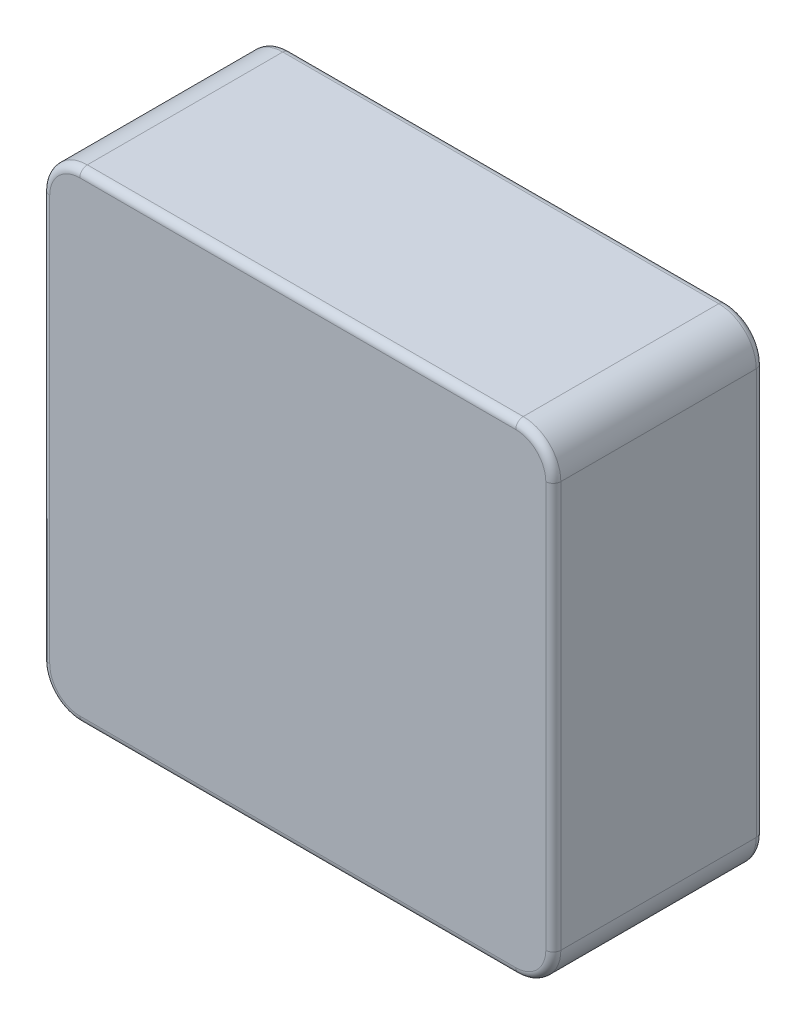
ISO-10303-21;
HEADER;
FILE_DESCRIPTION(('STEP AP214'),'2;1');
FILE_NAME('part.step','',(''),(''),'','','');
FILE_SCHEMA(('AUTOMOTIVE_DESIGN { 1 0 10303 214 1 1 1 1 }'));
ENDSEC;
DATA;
#1=APPLICATION_CONTEXT('core data for automotive mechanical design processes');
#2=APPLICATION_PROTOCOL_DEFINITION('international standard','automotive_design',2000,#1);
#3=PRODUCT_CONTEXT('',#1,'mechanical');
#4=PRODUCT('Part','Part','',(#3));
#5=PRODUCT_RELATED_PRODUCT_CATEGORY('part','',(#4));
#6=PRODUCT_DEFINITION_FORMATION('','',#4);
#7=PRODUCT_DEFINITION_CONTEXT('part definition',#1,'design');
#8=PRODUCT_DEFINITION('design','',#6,#7);
#9=PRODUCT_DEFINITION_SHAPE('','',#8);
#10=(LENGTH_UNIT() NAMED_UNIT(*) SI_UNIT(.MILLI.,.METRE.));
#11=(NAMED_UNIT(*) PLANE_ANGLE_UNIT() SI_UNIT($,.RADIAN.));
#12=(NAMED_UNIT(*) SI_UNIT($,.STERADIAN.) SOLID_ANGLE_UNIT());
#13=UNCERTAINTY_MEASURE_WITH_UNIT(LENGTH_MEASURE(1.E-05),#10,'distance_accuracy_value','');
#14=(GEOMETRIC_REPRESENTATION_CONTEXT(3) GLOBAL_UNCERTAINTY_ASSIGNED_CONTEXT((#13)) GLOBAL_UNIT_ASSIGNED_CONTEXT((#10,
#11,#12)) REPRESENTATION_CONTEXT('',''));
#15=CARTESIAN_POINT('',(0.,0.,0.));
#16=DIRECTION('',(0.,0.,1.));
#17=DIRECTION('',(1.,0.,0.));
#18=AXIS2_PLACEMENT_3D('',#15,#16,#17);
#19=CARTESIAN_POINT('',(2.9,-2.7,0.));
#20=DIRECTION('',(0.,0.,1.));
#21=DIRECTION('',(1.,0.,0.));
#22=AXIS2_PLACEMENT_3D('',#19,#20,#21);
#23=PLANE('',#22);
#24=DIRECTION('',(0.,1.,0.));
#25=VECTOR('',#24,1.);
#26=CARTESIAN_POINT('',(3.3,-2.7,0.));
#27=LINE('',#26,#25);
#28=CARTESIAN_POINT('',(3.3,2.7,0.));
#29=VERTEX_POINT('',#28);
#30=CARTESIAN_POINT('',(3.3,-2.7,0.));
#31=VERTEX_POINT('',#30);
#32=EDGE_CURVE('E287',#29,#31,#27,.F.);
#33=ORIENTED_EDGE('',*,*,#32,.T.);
#34=CARTESIAN_POINT('',(2.9,-2.7,0.));
#35=DIRECTION('',(0.,0.,1.));
#36=DIRECTION('',(1.,0.,0.));
#37=AXIS2_PLACEMENT_3D('',#34,#35,#36);
#38=CIRCLE('',#37,0.4);
#39=CARTESIAN_POINT('',(2.9,-3.1,0.));
#40=VERTEX_POINT('',#39);
#41=EDGE_CURVE('E301',#31,#40,#38,.F.);
#42=ORIENTED_EDGE('',*,*,#41,.T.);
#43=DIRECTION('',(1.,0.,0.));
#44=VECTOR('',#43,1.);
#45=CARTESIAN_POINT('',(2.9,-3.1,0.));
#46=LINE('',#45,#44);
#47=CARTESIAN_POINT('',(-2.9,-3.1,0.));
#48=VERTEX_POINT('',#47);
#49=EDGE_CURVE('E299',#40,#48,#46,.F.);
#50=ORIENTED_EDGE('',*,*,#49,.T.);
#51=CARTESIAN_POINT('',(-2.9,-2.7,0.));
#52=DIRECTION('',(0.,0.,1.));
#53=DIRECTION('',(1.,0.,0.));
#54=AXIS2_PLACEMENT_3D('',#51,#52,#53);
#55=CIRCLE('',#54,0.4);
#56=CARTESIAN_POINT('',(-3.3,-2.7,0.));
#57=VERTEX_POINT('',#56);
#58=EDGE_CURVE('E297',#48,#57,#55,.F.);
#59=ORIENTED_EDGE('',*,*,#58,.T.);
#60=DIRECTION('',(0.,-1.,0.));
#61=VECTOR('',#60,1.);
#62=CARTESIAN_POINT('',(-3.3,-2.7,0.));
#63=LINE('',#62,#61);
#64=CARTESIAN_POINT('',(-3.3,2.7,0.));
#65=VERTEX_POINT('',#64);
#66=EDGE_CURVE('E295',#57,#65,#63,.F.);
#67=ORIENTED_EDGE('',*,*,#66,.T.);
#68=CARTESIAN_POINT('',(-2.9,2.7,0.));
#69=DIRECTION('',(0.,0.,1.));
#70=DIRECTION('',(1.,0.,0.));
#71=AXIS2_PLACEMENT_3D('',#68,#69,#70);
#72=CIRCLE('',#71,0.4);
#73=CARTESIAN_POINT('',(-2.9,3.1,0.));
#74=VERTEX_POINT('',#73);
#75=EDGE_CURVE('E293',#65,#74,#72,.F.);
#76=ORIENTED_EDGE('',*,*,#75,.T.);
#77=DIRECTION('',(-1.,0.,0.));
#78=VECTOR('',#77,1.);
#79=CARTESIAN_POINT('',(2.9,3.1,0.));
#80=LINE('',#79,#78);
#81=CARTESIAN_POINT('',(2.9,3.1,0.));
#82=VERTEX_POINT('',#81);
#83=EDGE_CURVE('E291',#74,#82,#80,.F.);
#84=ORIENTED_EDGE('',*,*,#83,.T.);
#85=CARTESIAN_POINT('',(2.9,2.7,0.));
#86=DIRECTION('',(0.,0.,1.));
#87=DIRECTION('',(1.,0.,0.));
#88=AXIS2_PLACEMENT_3D('',#85,#86,#87);
#89=CIRCLE('',#88,0.4);
#90=EDGE_CURVE('E289',#82,#29,#89,.F.);
#91=ORIENTED_EDGE('',*,*,#90,.T.);
#92=EDGE_LOOP('',(#33,#42,#50,#59,#67,#76,#84,#91));
#93=FACE_BOUND('',#92,.T.);
#94=DIRECTION('',(0.,-1.,0.));
#95=VECTOR('',#94,1.);
#96=CARTESIAN_POINT('',(2.525,2.7,0.));
#97=LINE('',#96,#95);
#98=CARTESIAN_POINT('',(2.525,2.7,0.));
#99=VERTEX_POINT('',#98);
#100=CARTESIAN_POINT('',(2.525,1.3,0.));
#101=VERTEX_POINT('',#100);
#102=EDGE_CURVE('E220',#99,#101,#97,.T.);
#103=ORIENTED_EDGE('',*,*,#102,.F.);
#104=DIRECTION('',(1.,0.,0.));
#105=VECTOR('',#104,1.);
#106=CARTESIAN_POINT('',(2.525,2.7,0.));
#107=LINE('',#106,#105);
#108=CARTESIAN_POINT('',(-2.525,2.7,0.));
#109=VERTEX_POINT('',#108);
#110=EDGE_CURVE('E233',#109,#99,#107,.T.);
#111=ORIENTED_EDGE('',*,*,#110,.F.);
#112=DIRECTION('',(0.,1.,0.));
#113=VECTOR('',#112,1.);
#114=CARTESIAN_POINT('',(-2.525,2.7,0.));
#115=LINE('',#114,#113);
#116=CARTESIAN_POINT('',(-2.525,1.3,0.));
#117=VERTEX_POINT('',#116);
#118=EDGE_CURVE('E242',#117,#109,#115,.T.);
#119=ORIENTED_EDGE('',*,*,#118,.F.);
#120=DIRECTION('',(-1.,0.,0.));
#121=VECTOR('',#120,1.);
#122=CARTESIAN_POINT('',(2.525,1.3,0.));
#123=LINE('',#122,#121);
#124=EDGE_CURVE('E223',#101,#117,#123,.T.);
#125=ORIENTED_EDGE('',*,*,#124,.F.);
#126=EDGE_LOOP('',(#103,#111,#119,#125));
#127=FACE_BOUND('',#126,.T.);
#128=DIRECTION('',(0.,-1.,0.));
#129=VECTOR('',#128,1.);
#130=CARTESIAN_POINT('',(2.525,-1.3,0.));
#131=LINE('',#130,#129);
#132=CARTESIAN_POINT('',(2.525,-1.3,0.));
#133=VERTEX_POINT('',#132);
#134=CARTESIAN_POINT('',(2.525,-2.7,0.));
#135=VERTEX_POINT('',#134);
#136=EDGE_CURVE('E219',#133,#135,#131,.T.);
#137=ORIENTED_EDGE('',*,*,#136,.F.);
#138=DIRECTION('',(1.,0.,0.));
#139=VECTOR('',#138,1.);
#140=CARTESIAN_POINT('',(2.525,-1.3,0.));
#141=LINE('',#140,#139);
#142=CARTESIAN_POINT('',(-2.525,-1.3,0.));
#143=VERTEX_POINT('',#142);
#144=EDGE_CURVE('E216',#143,#133,#141,.T.);
#145=ORIENTED_EDGE('',*,*,#144,.F.);
#146=DIRECTION('',(0.,1.,0.));
#147=VECTOR('',#146,1.);
#148=CARTESIAN_POINT('',(-2.525,-1.3,0.));
#149=LINE('',#148,#147);
#150=CARTESIAN_POINT('',(-2.525,-2.7,0.));
#151=VERTEX_POINT('',#150);
#152=EDGE_CURVE('E792',#151,#143,#149,.T.);
#153=ORIENTED_EDGE('',*,*,#152,.F.);
#154=DIRECTION('',(-1.,0.,0.));
#155=VECTOR('',#154,1.);
#156=CARTESIAN_POINT('',(2.525,-2.7,0.));
#157=LINE('',#156,#155);
#158=EDGE_CURVE('E798',#135,#151,#157,.T.);
#159=ORIENTED_EDGE('',*,*,#158,.F.);
#160=EDGE_LOOP('',(#137,#145,#153,#159));
#161=FACE_BOUND('',#160,.T.);
#162=ADVANCED_FACE('F33',(#93,#127,#161),#23,.F.);
#163=CARTESIAN_POINT('',(2.9,-2.7,2.8));
#164=DIRECTION('',(0.,0.,-1.));
#165=DIRECTION('',(-1.,0.,0.));
#166=AXIS2_PLACEMENT_3D('',#163,#164,#165);
#167=CYLINDRICAL_SURFACE('',#166,0.5);
#168=DIRECTION('',(0.,0.,-1.));
#169=VECTOR('',#168,1.);
#170=CARTESIAN_POINT('',(2.9,-3.2,2.8));
#171=LINE('',#170,#169);
#172=CARTESIAN_POINT('',(2.9,-3.2,2.7));
#173=VERTEX_POINT('',#172);
#174=CARTESIAN_POINT('',(2.9,-3.2,0.0999999999999998));
#175=VERTEX_POINT('',#174);
#176=EDGE_CURVE('E258',#173,#175,#171,.T.);
#177=ORIENTED_EDGE('',*,*,#176,.T.);
#178=CARTESIAN_POINT('',(2.9,-2.7,0.0999999999999998));
#179=DIRECTION('',(0.,0.,1.));
#180=DIRECTION('',(1.,0.,0.));
#181=AXIS2_PLACEMENT_3D('',#178,#179,#180);
#182=CIRCLE('',#181,0.5);
#183=CARTESIAN_POINT('',(3.4,-2.7,0.0999999999999998));
#184=VERTEX_POINT('',#183);
#185=EDGE_CURVE('E284',#175,#184,#182,.T.);
#186=ORIENTED_EDGE('',*,*,#185,.T.);
#187=DIRECTION('',(0.,0.,-1.));
#188=VECTOR('',#187,1.);
#189=CARTESIAN_POINT('',(3.4,-2.7,2.8));
#190=LINE('',#189,#188);
#191=CARTESIAN_POINT('',(3.4,-2.7,2.7));
#192=VERTEX_POINT('',#191);
#193=EDGE_CURVE('E279',#192,#184,#190,.T.);
#194=ORIENTED_EDGE('',*,*,#193,.F.);
#195=CARTESIAN_POINT('',(2.9,-2.7,2.7));
#196=DIRECTION('',(0.,0.,1.));
#197=DIRECTION('',(1.,0.,0.));
#198=AXIS2_PLACEMENT_3D('',#195,#196,#197);
#199=CIRCLE('',#198,0.5);
#200=EDGE_CURVE('E282',#192,#173,#199,.F.);
#201=ORIENTED_EDGE('',*,*,#200,.T.);
#202=EDGE_LOOP('',(#177,#186,#194,#201));
#203=FACE_BOUND('',#202,.T.);
#204=ADVANCED_FACE('F477',(#203),#167,.T.);
#205=CARTESIAN_POINT('',(3.4,-2.7,2.8));
#206=DIRECTION('',(-1.,0.,0.));
#207=DIRECTION('',(0.,0.,1.));
#208=AXIS2_PLACEMENT_3D('',#205,#206,#207);
#209=PLANE('',#208);
#210=DIRECTION('',(0.,0.,-1.));
#211=VECTOR('',#210,1.);
#212=CARTESIAN_POINT('',(3.4,2.7,2.8));
#213=LINE('',#212,#211);
#214=CARTESIAN_POINT('',(3.4,2.7,2.7));
#215=VERTEX_POINT('',#214);
#216=CARTESIAN_POINT('',(3.4,2.7,0.0999999999999998));
#217=VERTEX_POINT('',#216);
#218=EDGE_CURVE('E276',#215,#217,#213,.T.);
#219=ORIENTED_EDGE('',*,*,#218,.F.);
#220=DIRECTION('',(0.,1.,0.));
#221=VECTOR('',#220,1.);
#222=CARTESIAN_POINT('',(3.4,-2.7,2.7));
#223=LINE('',#222,#221);
#224=EDGE_CURVE('E11',#215,#192,#223,.F.);
#225=ORIENTED_EDGE('',*,*,#224,.T.);
#226=ORIENTED_EDGE('',*,*,#193,.T.);
#227=DIRECTION('',(0.,1.,0.));
#228=VECTOR('',#227,1.);
#229=CARTESIAN_POINT('',(3.4,-2.7,0.0999999999999998));
#230=LINE('',#229,#228);
#231=EDGE_CURVE('E42',#184,#217,#230,.T.);
#232=ORIENTED_EDGE('',*,*,#231,.T.);
#233=EDGE_LOOP('',(#219,#225,#226,#232));
#234=FACE_BOUND('',#233,.T.);
#235=ADVANCED_FACE('F496',(#234),#209,.F.);
#236=CARTESIAN_POINT('',(2.9,2.7,2.8));
#237=DIRECTION('',(0.,0.,-1.));
#238=DIRECTION('',(-1.,0.,0.));
#239=AXIS2_PLACEMENT_3D('',#236,#237,#238);
#240=CYLINDRICAL_SURFACE('',#239,0.5);
#241=ORIENTED_EDGE('',*,*,#218,.T.);
#242=CARTESIAN_POINT('',(2.9,2.7,0.0999999999999998));
#243=DIRECTION('',(0.,0.,1.));
#244=DIRECTION('',(1.,0.,0.));
#245=AXIS2_PLACEMENT_3D('',#242,#243,#244);
#246=CIRCLE('',#245,0.5);
#247=CARTESIAN_POINT('',(2.9,3.2,0.0999999999999998));
#248=VERTEX_POINT('',#247);
#249=EDGE_CURVE('E327',#217,#248,#246,.T.);
#250=ORIENTED_EDGE('',*,*,#249,.T.);
#251=DIRECTION('',(0.,0.,-1.));
#252=VECTOR('',#251,1.);
#253=CARTESIAN_POINT('',(2.9,3.2,2.8));
#254=LINE('',#253,#252);
#255=CARTESIAN_POINT('',(2.9,3.2,2.7));
#256=VERTEX_POINT('',#255);
#257=EDGE_CURVE('E273',#256,#248,#254,.T.);
#258=ORIENTED_EDGE('',*,*,#257,.F.);
#259=CARTESIAN_POINT('',(2.9,2.7,2.7));
#260=DIRECTION('',(0.,0.,1.));
#261=DIRECTION('',(1.,0.,0.));
#262=AXIS2_PLACEMENT_3D('',#259,#260,#261);
#263=CIRCLE('',#262,0.5);
#264=EDGE_CURVE('E325',#256,#215,#263,.F.);
#265=ORIENTED_EDGE('',*,*,#264,.T.);
#266=EDGE_LOOP('',(#241,#250,#258,#265));
#267=FACE_BOUND('',#266,.T.);
#268=ADVANCED_FACE('F403',(#267),#240,.T.);
#269=CARTESIAN_POINT('',(-2.9,3.2,2.8));
#270=DIRECTION('',(0.,-1.,0.));
#271=DIRECTION('',(0.,0.,-1.));
#272=AXIS2_PLACEMENT_3D('',#269,#270,#271);
#273=PLANE('',#272);
#274=ORIENTED_EDGE('',*,*,#257,.T.);
#275=DIRECTION('',(-1.,0.,0.));
#276=VECTOR('',#275,1.);
#277=CARTESIAN_POINT('',(-2.9,3.2,0.0999999999999998));
#278=LINE('',#277,#276);
#279=CARTESIAN_POINT('',(-2.9,3.2,0.0999999999999998));
#280=VERTEX_POINT('',#279);
#281=EDGE_CURVE('E323',#248,#280,#278,.T.);
#282=ORIENTED_EDGE('',*,*,#281,.T.);
#283=DIRECTION('',(0.,0.,-1.));
#284=VECTOR('',#283,1.);
#285=CARTESIAN_POINT('',(-2.9,3.2,2.8));
#286=LINE('',#285,#284);
#287=CARTESIAN_POINT('',(-2.9,3.2,2.7));
#288=VERTEX_POINT('',#287);
#289=EDGE_CURVE('E270',#288,#280,#286,.T.);
#290=ORIENTED_EDGE('',*,*,#289,.F.);
#291=DIRECTION('',(-1.,0.,0.));
#292=VECTOR('',#291,1.);
#293=CARTESIAN_POINT('',(2.9,3.2,2.7));
#294=LINE('',#293,#292);
#295=EDGE_CURVE('E321',#288,#256,#294,.F.);
#296=ORIENTED_EDGE('',*,*,#295,.T.);
#297=EDGE_LOOP('',(#274,#282,#290,#296));
#298=FACE_BOUND('',#297,.T.);
#299=ADVANCED_FACE('F400',(#298),#273,.F.);
#300=CARTESIAN_POINT('',(-2.9,2.7,2.8));
#301=DIRECTION('',(0.,0.,-1.));
#302=DIRECTION('',(-1.,0.,0.));
#303=AXIS2_PLACEMENT_3D('',#300,#301,#302);
#304=CYLINDRICAL_SURFACE('',#303,0.5);
#305=ORIENTED_EDGE('',*,*,#289,.T.);
#306=CARTESIAN_POINT('',(-2.9,2.7,0.0999999999999998));
#307=DIRECTION('',(0.,0.,1.));
#308=DIRECTION('',(1.,0.,0.));
#309=AXIS2_PLACEMENT_3D('',#306,#307,#308);
#310=CIRCLE('',#309,0.5);
#311=CARTESIAN_POINT('',(-3.4,2.7,0.0999999999999998));
#312=VERTEX_POINT('',#311);
#313=EDGE_CURVE('E319',#280,#312,#310,.T.);
#314=ORIENTED_EDGE('',*,*,#313,.T.);
#315=DIRECTION('',(0.,0.,-1.));
#316=VECTOR('',#315,1.);
#317=CARTESIAN_POINT('',(-3.4,2.7,2.8));
#318=LINE('',#317,#316);
#319=CARTESIAN_POINT('',(-3.4,2.7,2.7));
#320=VERTEX_POINT('',#319);
#321=EDGE_CURVE('E267',#320,#312,#318,.T.);
#322=ORIENTED_EDGE('',*,*,#321,.F.);
#323=CARTESIAN_POINT('',(-2.9,2.7,2.7));
#324=DIRECTION('',(0.,0.,1.));
#325=DIRECTION('',(1.,0.,0.));
#326=AXIS2_PLACEMENT_3D('',#323,#324,#325);
#327=CIRCLE('',#326,0.5);
#328=EDGE_CURVE('E317',#320,#288,#327,.F.);
#329=ORIENTED_EDGE('',*,*,#328,.T.);
#330=EDGE_LOOP('',(#305,#314,#322,#329));
#331=FACE_BOUND('',#330,.T.);
#332=ADVANCED_FACE('F447',(#331),#304,.T.);
#333=CARTESIAN_POINT('',(-3.4,-2.7,2.8));
#334=DIRECTION('',(1.,0.,0.));
#335=DIRECTION('',(0.,0.,-1.));
#336=AXIS2_PLACEMENT_3D('',#333,#334,#335);
#337=PLANE('',#336);
#338=ORIENTED_EDGE('',*,*,#321,.T.);
#339=DIRECTION('',(0.,-1.,0.));
#340=VECTOR('',#339,1.);
#341=CARTESIAN_POINT('',(-3.4,-2.7,0.0999999999999998));
#342=LINE('',#341,#340);
#343=CARTESIAN_POINT('',(-3.4,-2.7,0.0999999999999998));
#344=VERTEX_POINT('',#343);
#345=EDGE_CURVE('E315',#312,#344,#342,.T.);
#346=ORIENTED_EDGE('',*,*,#345,.T.);
#347=DIRECTION('',(0.,0.,-1.));
#348=VECTOR('',#347,1.);
#349=CARTESIAN_POINT('',(-3.4,-2.7,2.8));
#350=LINE('',#349,#348);
#351=CARTESIAN_POINT('',(-3.4,-2.7,2.7));
#352=VERTEX_POINT('',#351);
#353=EDGE_CURVE('E264',#352,#344,#350,.T.);
#354=ORIENTED_EDGE('',*,*,#353,.F.);
#355=DIRECTION('',(0.,-1.,0.));
#356=VECTOR('',#355,1.);
#357=CARTESIAN_POINT('',(-3.4,2.7,2.7));
#358=LINE('',#357,#356);
#359=EDGE_CURVE('E313',#352,#320,#358,.F.);
#360=ORIENTED_EDGE('',*,*,#359,.T.);
#361=EDGE_LOOP('',(#338,#346,#354,#360));
#362=FACE_BOUND('',#361,.T.);
#363=ADVANCED_FACE('F450',(#362),#337,.F.);
#364=CARTESIAN_POINT('',(-2.9,-2.7,2.8));
#365=DIRECTION('',(0.,0.,-1.));
#366=DIRECTION('',(-1.,0.,0.));
#367=AXIS2_PLACEMENT_3D('',#364,#365,#366);
#368=CYLINDRICAL_SURFACE('',#367,0.5);
#369=ORIENTED_EDGE('',*,*,#353,.T.);
#370=CARTESIAN_POINT('',(-2.9,-2.7,0.0999999999999998));
#371=DIRECTION('',(0.,0.,1.));
#372=DIRECTION('',(1.,0.,0.));
#373=AXIS2_PLACEMENT_3D('',#370,#371,#372);
#374=CIRCLE('',#373,0.5);
#375=CARTESIAN_POINT('',(-2.9,-3.2,0.0999999999999998));
#376=VERTEX_POINT('',#375);
#377=EDGE_CURVE('E311',#344,#376,#374,.T.);
#378=ORIENTED_EDGE('',*,*,#377,.T.);
#379=DIRECTION('',(0.,0.,-1.));
#380=VECTOR('',#379,1.);
#381=CARTESIAN_POINT('',(-2.9,-3.2,2.8));
#382=LINE('',#381,#380);
#383=CARTESIAN_POINT('',(-2.9,-3.2,2.7));
#384=VERTEX_POINT('',#383);
#385=EDGE_CURVE('E261',#384,#376,#382,.T.);
#386=ORIENTED_EDGE('',*,*,#385,.F.);
#387=CARTESIAN_POINT('',(-2.9,-2.7,2.7));
#388=DIRECTION('',(0.,0.,1.));
#389=DIRECTION('',(1.,0.,0.));
#390=AXIS2_PLACEMENT_3D('',#387,#388,#389);
#391=CIRCLE('',#390,0.5);
#392=EDGE_CURVE('E309',#384,#352,#391,.F.);
#393=ORIENTED_EDGE('',*,*,#392,.T.);
#394=EDGE_LOOP('',(#369,#378,#386,#393));
#395=FACE_BOUND('',#394,.T.);
#396=ADVANCED_FACE('F482',(#395),#368,.T.);
#397=CARTESIAN_POINT('',(-2.9,-3.2,2.8));
#398=DIRECTION('',(0.,1.,0.));
#399=DIRECTION('',(0.,0.,1.));
#400=AXIS2_PLACEMENT_3D('',#397,#398,#399);
#401=PLANE('',#400);
#402=ORIENTED_EDGE('',*,*,#385,.T.);
#403=DIRECTION('',(1.,0.,0.));
#404=VECTOR('',#403,1.);
#405=CARTESIAN_POINT('',(-2.9,-3.2,0.0999999999999998));
#406=LINE('',#405,#404);
#407=EDGE_CURVE('E307',#376,#175,#406,.T.);
#408=ORIENTED_EDGE('',*,*,#407,.T.);
#409=ORIENTED_EDGE('',*,*,#176,.F.);
#410=DIRECTION('',(1.,0.,0.));
#411=VECTOR('',#410,1.);
#412=CARTESIAN_POINT('',(-2.9,-3.2,2.7));
#413=LINE('',#412,#411);
#414=EDGE_CURVE('E304',#173,#384,#413,.F.);
#415=ORIENTED_EDGE('',*,*,#414,.T.);
#416=EDGE_LOOP('',(#402,#408,#409,#415));
#417=FACE_BOUND('',#416,.T.);
#418=ADVANCED_FACE('F479',(#417),#401,.F.);
#419=CARTESIAN_POINT('',(2.9,-2.7,2.8));
#420=DIRECTION('',(0.,0.,1.));
#421=DIRECTION('',(1.,0.,0.));
#422=AXIS2_PLACEMENT_3D('',#419,#420,#421);
#423=PLANE('',#422);
#424=CARTESIAN_POINT('',(-2.9,-2.7,2.8));
#425=DIRECTION('',(0.,0.,1.));
#426=DIRECTION('',(1.,0.,0.));
#427=AXIS2_PLACEMENT_3D('',#424,#425,#426);
#428=CIRCLE('',#427,0.4);
#429=CARTESIAN_POINT('',(-3.3,-2.7,2.8));
#430=VERTEX_POINT('',#429);
#431=CARTESIAN_POINT('',(-2.9,-3.1,2.8));
#432=VERTEX_POINT('',#431);
#433=EDGE_CURVE('E50',#430,#432,#428,.T.);
#434=ORIENTED_EDGE('',*,*,#433,.T.);
#435=DIRECTION('',(1.,0.,0.));
#436=VECTOR('',#435,1.);
#437=CARTESIAN_POINT('',(2.9,-3.1,2.8));
#438=LINE('',#437,#436);
#439=CARTESIAN_POINT('',(2.9,-3.1,2.8));
#440=VERTEX_POINT('',#439);
#441=EDGE_CURVE('E341',#432,#440,#438,.T.);
#442=ORIENTED_EDGE('',*,*,#441,.T.);
#443=CARTESIAN_POINT('',(2.9,-2.7,2.8));
#444=DIRECTION('',(0.,0.,1.));
#445=DIRECTION('',(1.,0.,0.));
#446=AXIS2_PLACEMENT_3D('',#443,#444,#445);
#447=CIRCLE('',#446,0.4);
#448=CARTESIAN_POINT('',(3.3,-2.7,2.8));
#449=VERTEX_POINT('',#448);
#450=EDGE_CURVE('E329',#440,#449,#447,.T.);
#451=ORIENTED_EDGE('',*,*,#450,.T.);
#452=DIRECTION('',(0.,1.,0.));
#453=VECTOR('',#452,1.);
#454=CARTESIAN_POINT('',(3.3,2.7,2.8));
#455=LINE('',#454,#453);
#456=CARTESIAN_POINT('',(3.3,2.7,2.8));
#457=VERTEX_POINT('',#456);
#458=EDGE_CURVE('E331',#449,#457,#455,.T.);
#459=ORIENTED_EDGE('',*,*,#458,.T.);
#460=CARTESIAN_POINT('',(2.9,2.7,2.8));
#461=DIRECTION('',(0.,0.,1.));
#462=DIRECTION('',(1.,0.,0.));
#463=AXIS2_PLACEMENT_3D('',#460,#461,#462);
#464=CIRCLE('',#463,0.4);
#465=CARTESIAN_POINT('',(2.9,3.1,2.8));
#466=VERTEX_POINT('',#465);
#467=EDGE_CURVE('E333',#457,#466,#464,.T.);
#468=ORIENTED_EDGE('',*,*,#467,.T.);
#469=DIRECTION('',(-1.,0.,0.));
#470=VECTOR('',#469,1.);
#471=CARTESIAN_POINT('',(-2.9,3.1,2.8));
#472=LINE('',#471,#470);
#473=CARTESIAN_POINT('',(-2.9,3.1,2.8));
#474=VERTEX_POINT('',#473);
#475=EDGE_CURVE('E335',#466,#474,#472,.T.);
#476=ORIENTED_EDGE('',*,*,#475,.T.);
#477=CARTESIAN_POINT('',(-2.9,2.7,2.8));
#478=DIRECTION('',(0.,0.,1.));
#479=DIRECTION('',(1.,0.,0.));
#480=AXIS2_PLACEMENT_3D('',#477,#478,#479);
#481=CIRCLE('',#480,0.4);
#482=CARTESIAN_POINT('',(-3.3,2.7,2.8));
#483=VERTEX_POINT('',#482);
#484=EDGE_CURVE('E337',#474,#483,#481,.T.);
#485=ORIENTED_EDGE('',*,*,#484,.T.);
#486=DIRECTION('',(0.,-1.,0.));
#487=VECTOR('',#486,1.);
#488=CARTESIAN_POINT('',(-3.3,-2.7,2.8));
#489=LINE('',#488,#487);
#490=EDGE_CURVE('E55',#483,#430,#489,.T.);
#491=ORIENTED_EDGE('',*,*,#490,.T.);
#492=EDGE_LOOP('',(#434,#442,#451,#459,#468,#476,#485,#491));
#493=FACE_BOUND('',#492,.T.);
#494=ADVANCED_FACE('F464',(#493),#423,.T.);
#495=CARTESIAN_POINT('',(2.525,2.7,-0.1));
#496=DIRECTION('',(-1.,0.,0.));
#497=DIRECTION('',(0.,0.,1.));
#498=AXIS2_PLACEMENT_3D('',#495,#496,#497);
#499=PLANE('',#498);
#500=ORIENTED_EDGE('',*,*,#102,.T.);
#501=DIRECTION('',(0.,0.,1.));
#502=VECTOR('',#501,1.);
#503=CARTESIAN_POINT('',(2.525,1.3,-0.1));
#504=LINE('',#503,#502);
#505=CARTESIAN_POINT('',(2.525,1.3,-0.1));
#506=VERTEX_POINT('',#505);
#507=EDGE_CURVE('E255',#506,#101,#504,.T.);
#508=ORIENTED_EDGE('',*,*,#507,.F.);
#509=DIRECTION('',(0.,-1.,0.));
#510=VECTOR('',#509,1.);
#511=CARTESIAN_POINT('',(2.525,2.7,-0.1));
#512=LINE('',#511,#510);
#513=CARTESIAN_POINT('',(2.525,2.7,-0.1));
#514=VERTEX_POINT('',#513);
#515=EDGE_CURVE('E229',#514,#506,#512,.T.);
#516=ORIENTED_EDGE('',*,*,#515,.F.);
#517=DIRECTION('',(0.,0.,1.));
#518=VECTOR('',#517,1.);
#519=CARTESIAN_POINT('',(2.525,2.7,-0.1));
#520=LINE('',#519,#518);
#521=EDGE_CURVE('E238',#514,#99,#520,.T.);
#522=ORIENTED_EDGE('',*,*,#521,.T.);
#523=EDGE_LOOP('',(#500,#508,#516,#522));
#524=FACE_BOUND('',#523,.T.);
#525=ADVANCED_FACE('F501',(#524),#499,.F.);
#526=CARTESIAN_POINT('',(2.525,1.3,-0.1));
#527=DIRECTION('',(0.,1.,0.));
#528=DIRECTION('',(-1.,0.,0.));
#529=AXIS2_PLACEMENT_3D('',#526,#527,#528);
#530=PLANE('',#529);
#531=ORIENTED_EDGE('',*,*,#124,.T.);
#532=DIRECTION('',(0.,0.,1.));
#533=VECTOR('',#532,1.);
#534=CARTESIAN_POINT('',(-2.525,1.3,-0.1));
#535=LINE('',#534,#533);
#536=CARTESIAN_POINT('',(-2.525,1.3,-0.1));
#537=VERTEX_POINT('',#536);
#538=EDGE_CURVE('E252',#537,#117,#535,.T.);
#539=ORIENTED_EDGE('',*,*,#538,.F.);
#540=DIRECTION('',(-1.,0.,0.));
#541=VECTOR('',#540,1.);
#542=CARTESIAN_POINT('',(2.525,1.3,-0.1));
#543=LINE('',#542,#541);
#544=EDGE_CURVE('E232',#506,#537,#543,.T.);
#545=ORIENTED_EDGE('',*,*,#544,.F.);
#546=ORIENTED_EDGE('',*,*,#507,.T.);
#547=EDGE_LOOP('',(#531,#539,#545,#546));
#548=FACE_BOUND('',#547,.T.);
#549=ADVANCED_FACE('F504',(#548),#530,.F.);
#550=CARTESIAN_POINT('',(-2.525,2.7,-0.1));
#551=DIRECTION('',(1.,0.,0.));
#552=DIRECTION('',(0.,1.,0.));
#553=AXIS2_PLACEMENT_3D('',#550,#551,#552);
#554=PLANE('',#553);
#555=ORIENTED_EDGE('',*,*,#118,.T.);
#556=DIRECTION('',(0.,0.,1.));
#557=VECTOR('',#556,1.);
#558=CARTESIAN_POINT('',(-2.525,2.7,-0.1));
#559=LINE('',#558,#557);
#560=CARTESIAN_POINT('',(-2.525,2.7,-0.1));
#561=VERTEX_POINT('',#560);
#562=EDGE_CURVE('E249',#561,#109,#559,.T.);
#563=ORIENTED_EDGE('',*,*,#562,.F.);
#564=DIRECTION('',(0.,1.,0.));
#565=VECTOR('',#564,1.);
#566=CARTESIAN_POINT('',(-2.525,2.7,-0.1));
#567=LINE('',#566,#565);
#568=EDGE_CURVE('E235',#537,#561,#567,.T.);
#569=ORIENTED_EDGE('',*,*,#568,.F.);
#570=ORIENTED_EDGE('',*,*,#538,.T.);
#571=EDGE_LOOP('',(#555,#563,#569,#570));
#572=FACE_BOUND('',#571,.T.);
#573=ADVANCED_FACE('F508',(#572),#554,.F.);
#574=CARTESIAN_POINT('',(2.525,2.7,-0.1));
#575=DIRECTION('',(0.,-1.,0.));
#576=DIRECTION('',(1.,0.,0.));
#577=AXIS2_PLACEMENT_3D('',#574,#575,#576);
#578=PLANE('',#577);
#579=ORIENTED_EDGE('',*,*,#110,.T.);
#580=ORIENTED_EDGE('',*,*,#521,.F.);
#581=DIRECTION('',(1.,0.,0.));
#582=VECTOR('',#581,1.);
#583=CARTESIAN_POINT('',(2.525,2.7,-0.1));
#584=LINE('',#583,#582);
#585=EDGE_CURVE('E237',#561,#514,#584,.T.);
#586=ORIENTED_EDGE('',*,*,#585,.F.);
#587=ORIENTED_EDGE('',*,*,#562,.T.);
#588=EDGE_LOOP('',(#579,#580,#586,#587));
#589=FACE_BOUND('',#588,.T.);
#590=ADVANCED_FACE('F512',(#589),#578,.F.);
#591=CARTESIAN_POINT('',(0.,0.,-0.1));
#592=DIRECTION('',(0.,0.,-1.));
#593=DIRECTION('',(-1.,0.,0.));
#594=AXIS2_PLACEMENT_3D('',#591,#592,#593);
#595=PLANE('',#594);
#596=ORIENTED_EDGE('',*,*,#515,.T.);
#597=ORIENTED_EDGE('',*,*,#544,.T.);
#598=ORIENTED_EDGE('',*,*,#568,.T.);
#599=ORIENTED_EDGE('',*,*,#585,.T.);
#600=EDGE_LOOP('',(#596,#597,#598,#599));
#601=FACE_BOUND('',#600,.T.);
#602=ADVANCED_FACE('F516',(#601),#595,.T.);
#603=CARTESIAN_POINT('',(2.525,-1.3,-0.1));
#604=DIRECTION('',(-1.,0.,0.));
#605=DIRECTION('',(0.,-1.,0.));
#606=AXIS2_PLACEMENT_3D('',#603,#604,#605);
#607=PLANE('',#606);
#608=ORIENTED_EDGE('',*,*,#136,.T.);
#609=DIRECTION('',(0.,0.,1.));
#610=VECTOR('',#609,1.);
#611=CARTESIAN_POINT('',(2.525,-2.7,-0.1));
#612=LINE('',#611,#610);
#613=CARTESIAN_POINT('',(2.525,-2.7,-0.1));
#614=VERTEX_POINT('',#613);
#615=EDGE_CURVE('E200',#614,#135,#612,.T.);
#616=ORIENTED_EDGE('',*,*,#615,.F.);
#617=DIRECTION('',(0.,-1.,0.));
#618=VECTOR('',#617,1.);
#619=CARTESIAN_POINT('',(2.525,-1.3,-0.1));
#620=LINE('',#619,#618);
#621=CARTESIAN_POINT('',(2.525,-1.3,-0.1));
#622=VERTEX_POINT('',#621);
#623=EDGE_CURVE('E207',#622,#614,#620,.T.);
#624=ORIENTED_EDGE('',*,*,#623,.F.);
#625=DIRECTION('',(0.,0.,1.));
#626=VECTOR('',#625,1.);
#627=CARTESIAN_POINT('',(2.525,-1.3,-0.1));
#628=LINE('',#627,#626);
#629=EDGE_CURVE('E788',#622,#133,#628,.T.);
#630=ORIENTED_EDGE('',*,*,#629,.T.);
#631=EDGE_LOOP('',(#608,#616,#624,#630));
#632=FACE_BOUND('',#631,.T.);
#633=ADVANCED_FACE('F218',(#632),#607,.F.);
#634=CARTESIAN_POINT('',(2.525,-2.7,-0.1));
#635=DIRECTION('',(0.,1.,0.));
#636=DIRECTION('',(0.,0.,1.));
#637=AXIS2_PLACEMENT_3D('',#634,#635,#636);
#638=PLANE('',#637);
#639=ORIENTED_EDGE('',*,*,#158,.T.);
#640=DIRECTION('',(0.,0.,1.));
#641=VECTOR('',#640,1.);
#642=CARTESIAN_POINT('',(-2.525,-2.7,-0.1));
#643=LINE('',#642,#641);
#644=CARTESIAN_POINT('',(-2.525,-2.7,-0.1));
#645=VERTEX_POINT('',#644);
#646=EDGE_CURVE('E203',#645,#151,#643,.T.);
#647=ORIENTED_EDGE('',*,*,#646,.F.);
#648=DIRECTION('',(-1.,0.,0.));
#649=VECTOR('',#648,1.);
#650=CARTESIAN_POINT('',(2.525,-2.7,-0.1));
#651=LINE('',#650,#649);
#652=EDGE_CURVE('E195',#614,#645,#651,.T.);
#653=ORIENTED_EDGE('',*,*,#652,.F.);
#654=ORIENTED_EDGE('',*,*,#615,.T.);
#655=EDGE_LOOP('',(#639,#647,#653,#654));
#656=FACE_BOUND('',#655,.T.);
#657=ADVANCED_FACE('F198',(#656),#638,.F.);
#658=CARTESIAN_POINT('',(-2.525,-1.3,-0.1));
#659=DIRECTION('',(1.,0.,0.));
#660=DIRECTION('',(0.,1.,0.));
#661=AXIS2_PLACEMENT_3D('',#658,#659,#660);
#662=PLANE('',#661);
#663=ORIENTED_EDGE('',*,*,#152,.T.);
#664=DIRECTION('',(0.,0.,1.));
#665=VECTOR('',#664,1.);
#666=CARTESIAN_POINT('',(-2.525,-1.3,-0.1));
#667=LINE('',#666,#665);
#668=CARTESIAN_POINT('',(-2.525,-1.3,-0.1));
#669=VERTEX_POINT('',#668);
#670=EDGE_CURVE('E225',#669,#143,#667,.T.);
#671=ORIENTED_EDGE('',*,*,#670,.F.);
#672=DIRECTION('',(0.,1.,0.));
#673=VECTOR('',#672,1.);
#674=CARTESIAN_POINT('',(-2.525,-1.3,-0.1));
#675=LINE('',#674,#673);
#676=EDGE_CURVE('E206',#645,#669,#675,.T.);
#677=ORIENTED_EDGE('',*,*,#676,.F.);
#678=ORIENTED_EDGE('',*,*,#646,.T.);
#679=EDGE_LOOP('',(#663,#671,#677,#678));
#680=FACE_BOUND('',#679,.T.);
#681=ADVANCED_FACE('F525',(#680),#662,.F.);
#682=CARTESIAN_POINT('',(2.525,-1.3,-0.1));
#683=DIRECTION('',(0.,-1.,0.));
#684=DIRECTION('',(0.,0.,-1.));
#685=AXIS2_PLACEMENT_3D('',#682,#683,#684);
#686=PLANE('',#685);
#687=ORIENTED_EDGE('',*,*,#144,.T.);
#688=ORIENTED_EDGE('',*,*,#629,.F.);
#689=DIRECTION('',(1.,0.,0.));
#690=VECTOR('',#689,1.);
#691=CARTESIAN_POINT('',(2.525,-1.3,-0.1));
#692=LINE('',#691,#690);
#693=EDGE_CURVE('E212',#669,#622,#692,.T.);
#694=ORIENTED_EDGE('',*,*,#693,.F.);
#695=ORIENTED_EDGE('',*,*,#670,.T.);
#696=EDGE_LOOP('',(#687,#688,#694,#695));
#697=FACE_BOUND('',#696,.T.);
#698=ADVANCED_FACE('F528',(#697),#686,.F.);
#699=CARTESIAN_POINT('',(0.,0.,-0.1));
#700=DIRECTION('',(0.,0.,-1.));
#701=DIRECTION('',(-1.,0.,0.));
#702=AXIS2_PLACEMENT_3D('',#699,#700,#701);
#703=PLANE('',#702);
#704=ORIENTED_EDGE('',*,*,#623,.T.);
#705=ORIENTED_EDGE('',*,*,#652,.T.);
#706=ORIENTED_EDGE('',*,*,#676,.T.);
#707=ORIENTED_EDGE('',*,*,#693,.T.);
#708=EDGE_LOOP('',(#704,#705,#706,#707));
#709=FACE_BOUND('',#708,.T.);
#710=ADVANCED_FACE('F210',(#709),#703,.T.);
#711=CARTESIAN_POINT('',(-2.9,2.7,0.0999999999999998));
#712=DIRECTION('',(0.,0.,1.));
#713=DIRECTION('',(1.,0.,0.));
#714=AXIS2_PLACEMENT_3D('',#711,#712,#713);
#715=TOROIDAL_SURFACE('',#714,0.4,0.1);
#716=CARTESIAN_POINT('',(-2.9,3.1,0.1));
#717=DIRECTION('',(1.,0.,0.));
#718=DIRECTION('',(0.,1.,0.));
#719=AXIS2_PLACEMENT_3D('',#716,#717,#718);
#720=CIRCLE('',#719,0.1);
#721=EDGE_CURVE('E360',#74,#280,#720,.T.);
#722=ORIENTED_EDGE('',*,*,#721,.F.);
#723=ORIENTED_EDGE('',*,*,#75,.F.);
#724=CARTESIAN_POINT('',(-3.3,2.7,0.0999999999999998));
#725=DIRECTION('',(0.,-1.,0.));
#726=DIRECTION('',(0.,0.,-1.));
#727=AXIS2_PLACEMENT_3D('',#724,#725,#726);
#728=CIRCLE('',#727,0.1);
#729=EDGE_CURVE('E363',#312,#65,#728,.T.);
#730=ORIENTED_EDGE('',*,*,#729,.F.);
#731=ORIENTED_EDGE('',*,*,#313,.F.);
#732=EDGE_LOOP('',(#722,#723,#730,#731));
#733=FACE_BOUND('',#732,.T.);
#734=ADVANCED_FACE('F441',(#733),#715,.T.);
#735=CARTESIAN_POINT('',(-3.3,-2.7,0.0999999999999998));
#736=DIRECTION('',(0.,-1.,0.));
#737=DIRECTION('',(0.,0.,-1.));
#738=AXIS2_PLACEMENT_3D('',#735,#736,#737);
#739=CYLINDRICAL_SURFACE('',#738,0.1);
#740=ORIENTED_EDGE('',*,*,#729,.T.);
#741=ORIENTED_EDGE('',*,*,#66,.F.);
#742=CARTESIAN_POINT('',(-3.3,-2.7,0.0999999999999998));
#743=DIRECTION('',(0.,-1.,0.));
#744=DIRECTION('',(0.,0.,-1.));
#745=AXIS2_PLACEMENT_3D('',#742,#743,#744);
#746=CIRCLE('',#745,0.1);
#747=EDGE_CURVE('E357',#344,#57,#746,.T.);
#748=ORIENTED_EDGE('',*,*,#747,.F.);
#749=ORIENTED_EDGE('',*,*,#345,.F.);
#750=EDGE_LOOP('',(#740,#741,#748,#749));
#751=FACE_BOUND('',#750,.T.);
#752=ADVANCED_FACE('F436',(#751),#739,.T.);
#753=CARTESIAN_POINT('',(-2.9,3.1,0.0999999999999998));
#754=DIRECTION('',(-1.,0.,0.));
#755=DIRECTION('',(0.,0.,1.));
#756=AXIS2_PLACEMENT_3D('',#753,#754,#755);
#757=CYLINDRICAL_SURFACE('',#756,0.1);
#758=ORIENTED_EDGE('',*,*,#721,.T.);
#759=ORIENTED_EDGE('',*,*,#281,.F.);
#760=CARTESIAN_POINT('',(2.9,3.1,0.1));
#761=DIRECTION('',(1.,0.,0.));
#762=DIRECTION('',(0.,0.,-1.));
#763=AXIS2_PLACEMENT_3D('',#760,#761,#762);
#764=CIRCLE('',#763,0.1);
#765=EDGE_CURVE('E354',#82,#248,#764,.T.);
#766=ORIENTED_EDGE('',*,*,#765,.F.);
#767=ORIENTED_EDGE('',*,*,#83,.F.);
#768=EDGE_LOOP('',(#758,#759,#766,#767));
#769=FACE_BOUND('',#768,.T.);
#770=ADVANCED_FACE('F445',(#769),#757,.T.);
#771=CARTESIAN_POINT('',(-2.9,-2.7,0.0999999999999998));
#772=DIRECTION('',(0.,0.,1.));
#773=DIRECTION('',(1.,0.,0.));
#774=AXIS2_PLACEMENT_3D('',#771,#772,#773);
#775=TOROIDAL_SURFACE('',#774,0.4,0.1);
#776=ORIENTED_EDGE('',*,*,#747,.T.);
#777=ORIENTED_EDGE('',*,*,#58,.F.);
#778=CARTESIAN_POINT('',(-2.9,-3.1,0.0999999999999998));
#779=DIRECTION('',(1.,0.,0.));
#780=DIRECTION('',(0.,0.,-1.));
#781=AXIS2_PLACEMENT_3D('',#778,#779,#780);
#782=CIRCLE('',#781,0.1);
#783=EDGE_CURVE('E351',#376,#48,#782,.T.);
#784=ORIENTED_EDGE('',*,*,#783,.F.);
#785=ORIENTED_EDGE('',*,*,#377,.F.);
#786=EDGE_LOOP('',(#776,#777,#784,#785));
#787=FACE_BOUND('',#786,.T.);
#788=ADVANCED_FACE('F431',(#787),#775,.T.);
#789=CARTESIAN_POINT('',(2.9,2.7,0.0999999999999998));
#790=DIRECTION('',(0.,0.,1.));
#791=DIRECTION('',(1.,0.,0.));
#792=AXIS2_PLACEMENT_3D('',#789,#790,#791);
#793=TOROIDAL_SURFACE('',#792,0.4,0.1);
#794=ORIENTED_EDGE('',*,*,#765,.T.);
#795=ORIENTED_EDGE('',*,*,#249,.F.);
#796=CARTESIAN_POINT('',(3.3,2.7,0.1));
#797=DIRECTION('',(0.,-1.,0.));
#798=DIRECTION('',(1.,0.,0.));
#799=AXIS2_PLACEMENT_3D('',#796,#797,#798);
#800=CIRCLE('',#799,0.1);
#801=EDGE_CURVE('E348',#29,#217,#800,.T.);
#802=ORIENTED_EDGE('',*,*,#801,.F.);
#803=ORIENTED_EDGE('',*,*,#90,.F.);
#804=EDGE_LOOP('',(#794,#795,#802,#803));
#805=FACE_BOUND('',#804,.T.);
#806=ADVANCED_FACE('F408',(#805),#793,.T.);
#807=CARTESIAN_POINT('',(-2.9,-3.1,0.0999999999999998));
#808=DIRECTION('',(1.,0.,0.));
#809=DIRECTION('',(0.,0.,-1.));
#810=AXIS2_PLACEMENT_3D('',#807,#808,#809);
#811=CYLINDRICAL_SURFACE('',#810,0.1);
#812=ORIENTED_EDGE('',*,*,#783,.T.);
#813=ORIENTED_EDGE('',*,*,#49,.F.);
#814=CARTESIAN_POINT('',(2.9,-3.1,0.0999999999999998));
#815=DIRECTION('',(1.,0.,0.));
#816=DIRECTION('',(0.,0.,-1.));
#817=AXIS2_PLACEMENT_3D('',#814,#815,#816);
#818=CIRCLE('',#817,0.1);
#819=EDGE_CURVE('E346',#175,#40,#818,.T.);
#820=ORIENTED_EDGE('',*,*,#819,.F.);
#821=ORIENTED_EDGE('',*,*,#407,.F.);
#822=EDGE_LOOP('',(#812,#813,#820,#821));
#823=FACE_BOUND('',#822,.T.);
#824=ADVANCED_FACE('F426',(#823),#811,.T.);
#825=CARTESIAN_POINT('',(3.3,-2.7,0.0999999999999998));
#826=DIRECTION('',(0.,1.,0.));
#827=DIRECTION('',(0.,0.,1.));
#828=AXIS2_PLACEMENT_3D('',#825,#826,#827);
#829=CYLINDRICAL_SURFACE('',#828,0.1);
#830=ORIENTED_EDGE('',*,*,#801,.T.);
#831=ORIENTED_EDGE('',*,*,#231,.F.);
#832=CARTESIAN_POINT('',(3.3,-2.7,0.1));
#833=DIRECTION('',(0.,-1.,0.));
#834=DIRECTION('',(1.,0.,0.));
#835=AXIS2_PLACEMENT_3D('',#832,#833,#834);
#836=CIRCLE('',#835,0.1);
#837=EDGE_CURVE('E344',#31,#184,#836,.T.);
#838=ORIENTED_EDGE('',*,*,#837,.F.);
#839=ORIENTED_EDGE('',*,*,#32,.F.);
#840=EDGE_LOOP('',(#830,#831,#838,#839));
#841=FACE_BOUND('',#840,.T.);
#842=ADVANCED_FACE('F414',(#841),#829,.T.);
#843=CARTESIAN_POINT('',(2.9,-2.7,0.0999999999999998));
#844=DIRECTION('',(0.,0.,1.));
#845=DIRECTION('',(1.,0.,0.));
#846=AXIS2_PLACEMENT_3D('',#843,#844,#845);
#847=TOROIDAL_SURFACE('',#846,0.4,0.1);
#848=ORIENTED_EDGE('',*,*,#819,.T.);
#849=ORIENTED_EDGE('',*,*,#41,.F.);
#850=ORIENTED_EDGE('',*,*,#837,.T.);
#851=ORIENTED_EDGE('',*,*,#185,.F.);
#852=EDGE_LOOP('',(#848,#849,#850,#851));
#853=FACE_BOUND('',#852,.T.);
#854=ADVANCED_FACE('F420',(#853),#847,.T.);
#855=CARTESIAN_POINT('',(2.9,3.1,2.7));
#856=DIRECTION('',(1.,0.,0.));
#857=DIRECTION('',(0.,0.,-1.));
#858=AXIS2_PLACEMENT_3D('',#855,#856,#857);
#859=CYLINDRICAL_SURFACE('',#858,0.1);
#860=CARTESIAN_POINT('',(2.9,3.1,2.7));
#861=DIRECTION('',(1.,0.,0.));
#862=DIRECTION('',(0.,0.,-1.));
#863=AXIS2_PLACEMENT_3D('',#860,#861,#862);
#864=CIRCLE('',#863,0.1);
#865=EDGE_CURVE('E381',#256,#466,#864,.T.);
#866=ORIENTED_EDGE('',*,*,#865,.F.);
#867=ORIENTED_EDGE('',*,*,#295,.F.);
#868=CARTESIAN_POINT('',(-2.9,3.1,2.7));
#869=DIRECTION('',(-1.,0.,0.));
#870=DIRECTION('',(0.,-1.,0.));
#871=AXIS2_PLACEMENT_3D('',#868,#869,#870);
#872=CIRCLE('',#871,0.1);
#873=EDGE_CURVE('E37',#474,#288,#872,.T.);
#874=ORIENTED_EDGE('',*,*,#873,.F.);
#875=ORIENTED_EDGE('',*,*,#475,.F.);
#876=EDGE_LOOP('',(#866,#867,#874,#875));
#877=FACE_BOUND('',#876,.T.);
#878=ADVANCED_FACE('F35',(#877),#859,.T.);
#879=CARTESIAN_POINT('',(-2.9,2.7,2.7));
#880=DIRECTION('',(0.,0.,1.));
#881=DIRECTION('',(1.,0.,0.));
#882=AXIS2_PLACEMENT_3D('',#879,#880,#881);
#883=TOROIDAL_SURFACE('',#882,0.4,0.1);
#884=ORIENTED_EDGE('',*,*,#873,.T.);
#885=ORIENTED_EDGE('',*,*,#328,.F.);
#886=CARTESIAN_POINT('',(-3.3,2.7,2.7));
#887=DIRECTION('',(0.,-1.,0.));
#888=DIRECTION('',(0.,0.,-1.));
#889=AXIS2_PLACEMENT_3D('',#886,#887,#888);
#890=CIRCLE('',#889,0.1);
#891=EDGE_CURVE('E379',#483,#320,#890,.T.);
#892=ORIENTED_EDGE('',*,*,#891,.F.);
#893=ORIENTED_EDGE('',*,*,#484,.F.);
#894=EDGE_LOOP('',(#884,#885,#892,#893));
#895=FACE_BOUND('',#894,.T.);
#896=ADVANCED_FACE('F392',(#895),#883,.T.);
#897=CARTESIAN_POINT('',(2.9,2.7,2.7));
#898=DIRECTION('',(0.,0.,1.));
#899=DIRECTION('',(1.,0.,0.));
#900=AXIS2_PLACEMENT_3D('',#897,#898,#899);
#901=TOROIDAL_SURFACE('',#900,0.4,0.1);
#902=ORIENTED_EDGE('',*,*,#865,.T.);
#903=ORIENTED_EDGE('',*,*,#467,.F.);
#904=CARTESIAN_POINT('',(3.3,2.7,2.7));
#905=DIRECTION('',(0.,-1.,0.));
#906=DIRECTION('',(1.,0.,0.));
#907=AXIS2_PLACEMENT_3D('',#904,#905,#906);
#908=CIRCLE('',#907,0.1);
#909=EDGE_CURVE('E376',#215,#457,#908,.T.);
#910=ORIENTED_EDGE('',*,*,#909,.F.);
#911=ORIENTED_EDGE('',*,*,#264,.F.);
#912=EDGE_LOOP('',(#902,#903,#910,#911));
#913=FACE_BOUND('',#912,.T.);
#914=ADVANCED_FACE('F554',(#913),#901,.T.);
#915=CARTESIAN_POINT('',(-3.3,-2.7,2.7));
#916=DIRECTION('',(0.,1.,0.));
#917=DIRECTION('',(0.,0.,1.));
#918=AXIS2_PLACEMENT_3D('',#915,#916,#917);
#919=CYLINDRICAL_SURFACE('',#918,0.1);
#920=ORIENTED_EDGE('',*,*,#891,.T.);
#921=ORIENTED_EDGE('',*,*,#359,.F.);
#922=CARTESIAN_POINT('',(-3.3,-2.7,2.7));
#923=DIRECTION('',(0.,-1.,0.));
#924=DIRECTION('',(0.,0.,-1.));
#925=AXIS2_PLACEMENT_3D('',#922,#923,#924);
#926=CIRCLE('',#925,0.1);
#927=EDGE_CURVE('E373',#430,#352,#926,.T.);
#928=ORIENTED_EDGE('',*,*,#927,.F.);
#929=ORIENTED_EDGE('',*,*,#490,.F.);
#930=EDGE_LOOP('',(#920,#921,#928,#929));
#931=FACE_BOUND('',#930,.T.);
#932=ADVANCED_FACE('F454',(#931),#919,.T.);
#933=CARTESIAN_POINT('',(3.3,-2.7,2.7));
#934=DIRECTION('',(0.,-1.,0.));
#935=DIRECTION('',(0.,0.,-1.));
#936=AXIS2_PLACEMENT_3D('',#933,#934,#935);
#937=CYLINDRICAL_SURFACE('',#936,0.1);
#938=ORIENTED_EDGE('',*,*,#909,.T.);
#939=ORIENTED_EDGE('',*,*,#458,.F.);
#940=CARTESIAN_POINT('',(3.3,-2.7,2.7));
#941=DIRECTION('',(0.,-1.,0.));
#942=DIRECTION('',(0.,0.,-1.));
#943=AXIS2_PLACEMENT_3D('',#940,#941,#942);
#944=CIRCLE('',#943,0.1);
#945=EDGE_CURVE('E370',#192,#449,#944,.T.);
#946=ORIENTED_EDGE('',*,*,#945,.F.);
#947=ORIENTED_EDGE('',*,*,#224,.F.);
#948=EDGE_LOOP('',(#938,#939,#946,#947));
#949=FACE_BOUND('',#948,.T.);
#950=ADVANCED_FACE('F469',(#949),#937,.T.);
#951=CARTESIAN_POINT('',(-2.9,-2.7,2.7));
#952=DIRECTION('',(0.,0.,1.));
#953=DIRECTION('',(1.,0.,0.));
#954=AXIS2_PLACEMENT_3D('',#951,#952,#953);
#955=TOROIDAL_SURFACE('',#954,0.4,0.1);
#956=ORIENTED_EDGE('',*,*,#927,.T.);
#957=ORIENTED_EDGE('',*,*,#392,.F.);
#958=CARTESIAN_POINT('',(-2.9,-3.1,2.7));
#959=DIRECTION('',(1.,0.,0.));
#960=DIRECTION('',(0.,0.,-1.));
#961=AXIS2_PLACEMENT_3D('',#958,#959,#960);
#962=CIRCLE('',#961,0.1);
#963=EDGE_CURVE('E368',#432,#384,#962,.T.);
#964=ORIENTED_EDGE('',*,*,#963,.F.);
#965=ORIENTED_EDGE('',*,*,#433,.F.);
#966=EDGE_LOOP('',(#956,#957,#964,#965));
#967=FACE_BOUND('',#966,.T.);
#968=ADVANCED_FACE('F457',(#967),#955,.T.);
#969=CARTESIAN_POINT('',(2.9,-2.7,2.7));
#970=DIRECTION('',(0.,0.,1.));
#971=DIRECTION('',(1.,0.,0.));
#972=AXIS2_PLACEMENT_3D('',#969,#970,#971);
#973=TOROIDAL_SURFACE('',#972,0.4,0.1);
#974=ORIENTED_EDGE('',*,*,#945,.T.);
#975=ORIENTED_EDGE('',*,*,#450,.F.);
#976=CARTESIAN_POINT('',(2.9,-3.1,2.7));
#977=DIRECTION('',(-1.,0.,0.));
#978=DIRECTION('',(0.,0.,1.));
#979=AXIS2_PLACEMENT_3D('',#976,#977,#978);
#980=CIRCLE('',#979,0.1);
#981=EDGE_CURVE('E366',#173,#440,#980,.T.);
#982=ORIENTED_EDGE('',*,*,#981,.F.);
#983=ORIENTED_EDGE('',*,*,#200,.F.);
#984=EDGE_LOOP('',(#974,#975,#982,#983));
#985=FACE_BOUND('',#984,.T.);
#986=ADVANCED_FACE('F473',(#985),#973,.T.);
#987=CARTESIAN_POINT('',(2.9,-3.1,2.7));
#988=DIRECTION('',(-1.,0.,0.));
#989=DIRECTION('',(0.,0.,1.));
#990=AXIS2_PLACEMENT_3D('',#987,#988,#989);
#991=CYLINDRICAL_SURFACE('',#990,0.1);
#992=ORIENTED_EDGE('',*,*,#963,.T.);
#993=ORIENTED_EDGE('',*,*,#414,.F.);
#994=ORIENTED_EDGE('',*,*,#981,.T.);
#995=ORIENTED_EDGE('',*,*,#441,.F.);
#996=EDGE_LOOP('',(#992,#993,#994,#995));
#997=FACE_BOUND('',#996,.T.);
#998=ADVANCED_FACE('F461',(#997),#991,.T.);
#999=CLOSED_SHELL('',(#162,#204,#235,#268,#299,#332,#363,#396,#418,#494,#525,#549,#573,#590,
#602,#633,#657,#681,#698,#710,#734,#752,#770,#788,#806,#824,#842,#854,#878,#896,#914,#932,#950,
#968,#986,#998));
#1000=MANIFOLD_SOLID_BREP('B2',#999);
#1001=ADVANCED_BREP_SHAPE_REPRESENTATION('',(#18,#1000),#14);
#1002=SHAPE_DEFINITION_REPRESENTATION(#9,#1001);
ENDSEC;
END-ISO-10303-21;
